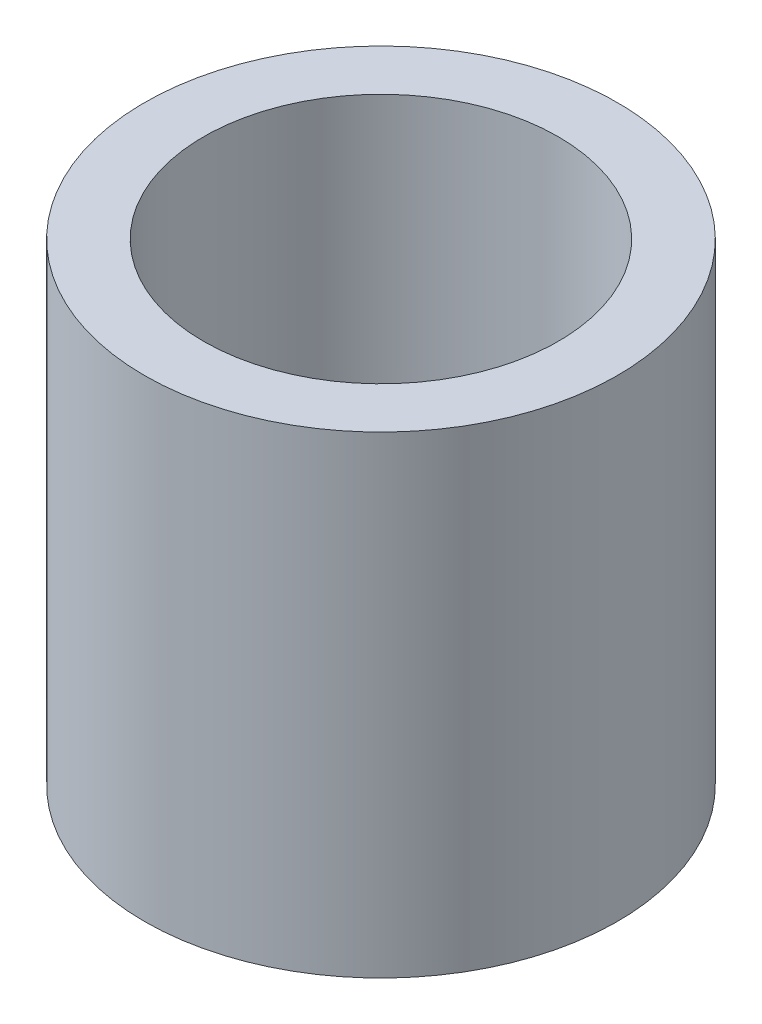
ISO-10303-21;
HEADER;
FILE_DESCRIPTION(('STEP AP214'),'2;1');
FILE_NAME('part.step','',(''),(''),'','','');
FILE_SCHEMA(('AUTOMOTIVE_DESIGN { 1 0 10303 214 1 1 1 1 }'));
ENDSEC;
DATA;
#1=APPLICATION_CONTEXT('core data for automotive mechanical design processes');
#2=APPLICATION_PROTOCOL_DEFINITION('international standard','automotive_design',2000,#1);
#3=PRODUCT_CONTEXT('',#1,'mechanical');
#4=PRODUCT('Part','Part','',(#3));
#5=PRODUCT_RELATED_PRODUCT_CATEGORY('part','',(#4));
#6=PRODUCT_DEFINITION_FORMATION('','',#4);
#7=PRODUCT_DEFINITION_CONTEXT('part definition',#1,'design');
#8=PRODUCT_DEFINITION('design','',#6,#7);
#9=PRODUCT_DEFINITION_SHAPE('','',#8);
#10=(LENGTH_UNIT() NAMED_UNIT(*) SI_UNIT(.MILLI.,.METRE.));
#11=(NAMED_UNIT(*) PLANE_ANGLE_UNIT() SI_UNIT($,.RADIAN.));
#12=(NAMED_UNIT(*) SI_UNIT($,.STERADIAN.) SOLID_ANGLE_UNIT());
#13=UNCERTAINTY_MEASURE_WITH_UNIT(LENGTH_MEASURE(1.E-05),#10,'distance_accuracy_value','');
#14=(GEOMETRIC_REPRESENTATION_CONTEXT(3) GLOBAL_UNCERTAINTY_ASSIGNED_CONTEXT((#13)) GLOBAL_UNIT_ASSIGNED_CONTEXT((#10,
#11,#12)) REPRESENTATION_CONTEXT('',''));
#15=CARTESIAN_POINT('',(0.,0.,0.));
#16=DIRECTION('',(0.,0.,1.));
#17=DIRECTION('',(1.,0.,0.));
#18=AXIS2_PLACEMENT_3D('',#15,#16,#17);
#19=CARTESIAN_POINT('',(0.,8.,0.));
#20=DIRECTION('',(0.,1.,0.));
#21=DIRECTION('',(0.,0.,1.));
#22=AXIS2_PLACEMENT_3D('',#19,#20,#21);
#23=PLANE('',#22);
#24=CARTESIAN_POINT('',(0.,8.,0.));
#25=DIRECTION('',(0.,1.,0.));
#26=DIRECTION('',(0.,0.,1.));
#27=AXIS2_PLACEMENT_3D('',#24,#25,#26);
#28=CIRCLE('',#27,4.);
#29=CARTESIAN_POINT('',(0.,8.,4.));
#30=VERTEX_POINT('',#29);
#31=EDGE_CURVE('E10',#30,#30,#28,.T.);
#32=ORIENTED_EDGE('',*,*,#31,.T.);
#33=EDGE_LOOP('',(#32));
#34=FACE_BOUND('',#33,.T.);
#35=CARTESIAN_POINT('',(0.,8.,0.));
#36=DIRECTION('',(0.,1.,0.));
#37=DIRECTION('',(0.,0.,1.));
#38=AXIS2_PLACEMENT_3D('',#35,#36,#37);
#39=CIRCLE('',#38,3.);
#40=CARTESIAN_POINT('',(0.,8.,3.));
#41=VERTEX_POINT('',#40);
#42=EDGE_CURVE('E42',#41,#41,#39,.T.);
#43=ORIENTED_EDGE('',*,*,#42,.F.);
#44=EDGE_LOOP('',(#43));
#45=FACE_BOUND('',#44,.T.);
#46=ADVANCED_FACE('F31',(#34,#45),#23,.T.);
#47=CARTESIAN_POINT('',(0.,0.,0.));
#48=DIRECTION('',(0.,1.,0.));
#49=DIRECTION('',(0.,0.,1.));
#50=AXIS2_PLACEMENT_3D('',#47,#48,#49);
#51=PLANE('',#50);
#52=CARTESIAN_POINT('',(0.,0.,0.));
#53=DIRECTION('',(0.,1.,0.));
#54=DIRECTION('',(0.,0.,1.));
#55=AXIS2_PLACEMENT_3D('',#52,#53,#54);
#56=CIRCLE('',#55,4.);
#57=CARTESIAN_POINT('',(0.,0.,4.));
#58=VERTEX_POINT('',#57);
#59=EDGE_CURVE('E35',#58,#58,#56,.T.);
#60=ORIENTED_EDGE('',*,*,#59,.F.);
#61=EDGE_LOOP('',(#60));
#62=FACE_BOUND('',#61,.T.);
#63=CARTESIAN_POINT('',(0.,0.,0.));
#64=DIRECTION('',(0.,1.,0.));
#65=DIRECTION('',(0.,0.,1.));
#66=AXIS2_PLACEMENT_3D('',#63,#64,#65);
#67=CIRCLE('',#66,3.);
#68=CARTESIAN_POINT('',(0.,0.,3.));
#69=VERTEX_POINT('',#68);
#70=EDGE_CURVE('E44',#69,#69,#67,.T.);
#71=ORIENTED_EDGE('',*,*,#70,.T.);
#72=EDGE_LOOP('',(#71));
#73=FACE_BOUND('',#72,.T.);
#74=ADVANCED_FACE('F54',(#62,#73),#51,.F.);
#75=CARTESIAN_POINT('',(0.,8.,0.));
#76=DIRECTION('',(0.,-1.,0.));
#77=DIRECTION('',(0.,0.,-1.));
#78=AXIS2_PLACEMENT_3D('',#75,#76,#77);
#79=CYLINDRICAL_SURFACE('',#78,4.);
#80=ORIENTED_EDGE('',*,*,#31,.F.);
#81=EDGE_LOOP('',(#80));
#82=FACE_BOUND('',#81,.T.);
#83=ORIENTED_EDGE('',*,*,#59,.T.);
#84=EDGE_LOOP('',(#83));
#85=FACE_BOUND('',#84,.T.);
#86=ADVANCED_FACE('F33',(#82,#85),#79,.T.);
#87=CARTESIAN_POINT('',(0.,8.,0.));
#88=DIRECTION('',(0.,-1.,0.));
#89=DIRECTION('',(0.,0.,-1.));
#90=AXIS2_PLACEMENT_3D('',#87,#88,#89);
#91=CYLINDRICAL_SURFACE('',#90,3.);
#92=ORIENTED_EDGE('',*,*,#42,.T.);
#93=EDGE_LOOP('',(#92));
#94=FACE_BOUND('',#93,.T.);
#95=ORIENTED_EDGE('',*,*,#70,.F.);
#96=EDGE_LOOP('',(#95));
#97=FACE_BOUND('',#96,.T.);
#98=ADVANCED_FACE('F50',(#94,#97),#91,.F.);
#99=CLOSED_SHELL('',(#46,#74,#86,#98));
#100=MANIFOLD_SOLID_BREP('B2',#99);
#101=ADVANCED_BREP_SHAPE_REPRESENTATION('',(#18,#100),#14);
#102=SHAPE_DEFINITION_REPRESENTATION(#9,#101);
ENDSEC;
END-ISO-10303-21;
